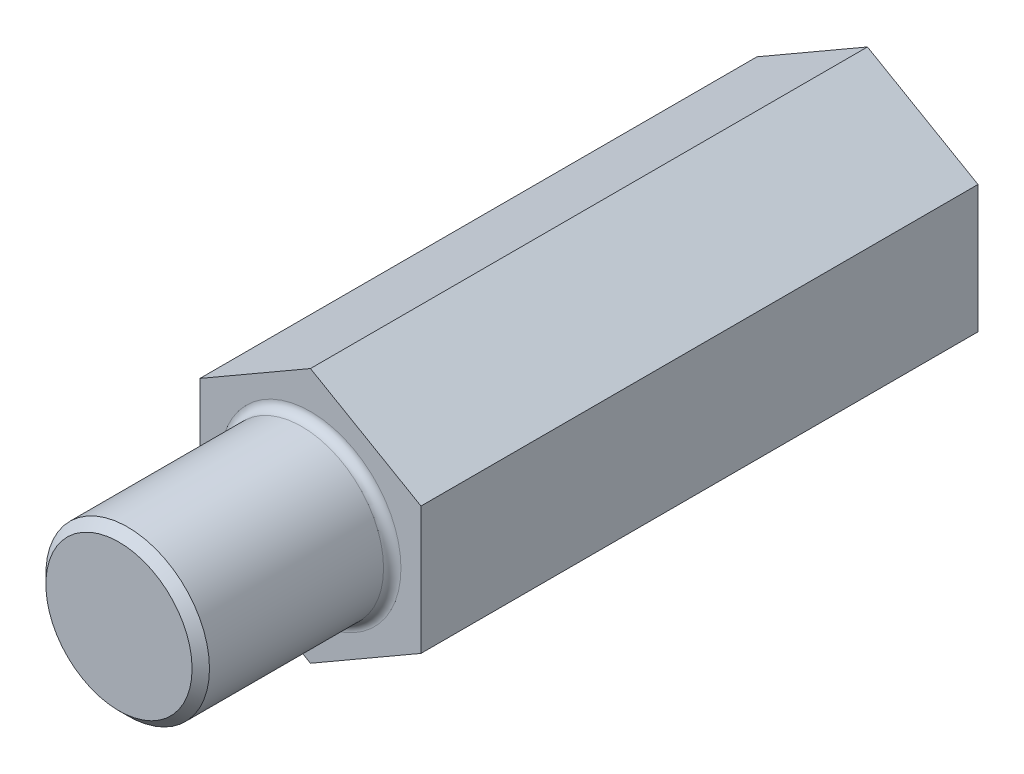
ISO-10303-21;
HEADER;
FILE_DESCRIPTION(('STEP AP214'),'2;1');
FILE_NAME('part.step','',(''),(''),'','','');
FILE_SCHEMA(('AUTOMOTIVE_DESIGN { 1 0 10303 214 1 1 1 1 }'));
ENDSEC;
DATA;
#1=APPLICATION_CONTEXT('core data for automotive mechanical design processes');
#2=APPLICATION_PROTOCOL_DEFINITION('international standard','automotive_design',2000,#1);
#3=PRODUCT_CONTEXT('',#1,'mechanical');
#4=PRODUCT('Part','Part','',(#3));
#5=PRODUCT_RELATED_PRODUCT_CATEGORY('part','',(#4));
#6=PRODUCT_DEFINITION_FORMATION('','',#4);
#7=PRODUCT_DEFINITION_CONTEXT('part definition',#1,'design');
#8=PRODUCT_DEFINITION('design','',#6,#7);
#9=PRODUCT_DEFINITION_SHAPE('','',#8);
#10=(LENGTH_UNIT() NAMED_UNIT(*) SI_UNIT(.MILLI.,.METRE.));
#11=(NAMED_UNIT(*) PLANE_ANGLE_UNIT() SI_UNIT($,.RADIAN.));
#12=(NAMED_UNIT(*) SI_UNIT($,.STERADIAN.) SOLID_ANGLE_UNIT());
#13=UNCERTAINTY_MEASURE_WITH_UNIT(LENGTH_MEASURE(1.E-05),#10,'distance_accuracy_value','');
#14=(GEOMETRIC_REPRESENTATION_CONTEXT(3) GLOBAL_UNCERTAINTY_ASSIGNED_CONTEXT((#13)) GLOBAL_UNIT_ASSIGNED_CONTEXT((#10,
#11,#12)) REPRESENTATION_CONTEXT('',''));
#15=CARTESIAN_POINT('',(0.,0.,0.));
#16=DIRECTION('',(0.,0.,1.));
#17=DIRECTION('',(1.,0.,0.));
#18=AXIS2_PLACEMENT_3D('',#15,#16,#17);
#19=CARTESIAN_POINT('',(6.34999999999996,3.6661742093542,43.));
#20=DIRECTION('',(-0.499999999999995,-0.866025403784442,0.));
#21=DIRECTION('',(0.866025403784442,-0.499999999999995,0.));
#22=AXIS2_PLACEMENT_3D('',#19,#20,#21);
#23=PLANE('',#22);
#24=DIRECTION('',(-0.866025403784442,0.499999999999995,0.));
#25=VECTOR('',#24,1.);
#26=CARTESIAN_POINT('',(6.34999999999996,3.6661742093542,32.));
#27=LINE('',#26,#25);
#28=CARTESIAN_POINT('',(6.34999999999996,3.6661742093542,32.));
#29=VERTEX_POINT('',#28);
#30=CARTESIAN_POINT('',(0.,7.33234841870825,32.));
#31=VERTEX_POINT('',#30);
#32=EDGE_CURVE('E111',#29,#31,#27,.T.);
#33=ORIENTED_EDGE('',*,*,#32,.F.);
#34=DIRECTION('',(0.,0.,-1.));
#35=VECTOR('',#34,1.);
#36=CARTESIAN_POINT('',(6.34999999999996,3.6661742093542,43.));
#37=LINE('',#36,#35);
#38=CARTESIAN_POINT('',(6.34999999999996,3.6661742093542,0.));
#39=VERTEX_POINT('',#38);
#40=EDGE_CURVE('E59',#29,#39,#37,.T.);
#41=ORIENTED_EDGE('',*,*,#40,.T.);
#42=DIRECTION('',(-0.866025403784442,0.499999999999995,0.));
#43=VECTOR('',#42,1.);
#44=CARTESIAN_POINT('',(6.34999999999996,3.6661742093542,0.));
#45=LINE('',#44,#43);
#46=CARTESIAN_POINT('',(0.,7.33234841870825,0.));
#47=VERTEX_POINT('',#46);
#48=EDGE_CURVE('E113',#39,#47,#45,.T.);
#49=ORIENTED_EDGE('',*,*,#48,.T.);
#50=DIRECTION('',(0.,0.,-1.));
#51=VECTOR('',#50,1.);
#52=CARTESIAN_POINT('',(0.,7.33234841870825,43.));
#53=LINE('',#52,#51);
#54=EDGE_CURVE('E138',#31,#47,#53,.T.);
#55=ORIENTED_EDGE('',*,*,#54,.F.);
#56=EDGE_LOOP('',(#33,#41,#49,#55));
#57=FACE_BOUND('',#56,.T.);
#58=ADVANCED_FACE('F35',(#57),#23,.F.);
#59=CARTESIAN_POINT('',(0.,7.33234841870825,43.));
#60=DIRECTION('',(0.500000000000001,-0.866025403784438,0.));
#61=DIRECTION('',(0.866025403784438,0.500000000000001,0.));
#62=AXIS2_PLACEMENT_3D('',#59,#60,#61);
#63=PLANE('',#62);
#64=DIRECTION('',(-0.866025403784438,-0.500000000000001,0.));
#65=VECTOR('',#64,1.);
#66=CARTESIAN_POINT('',(0.,7.33234841870825,32.));
#67=LINE('',#66,#65);
#68=CARTESIAN_POINT('',(-6.35000000000001,3.66617420935411,32.));
#69=VERTEX_POINT('',#68);
#70=EDGE_CURVE('E109',#31,#69,#67,.T.);
#71=ORIENTED_EDGE('',*,*,#70,.F.);
#72=ORIENTED_EDGE('',*,*,#54,.T.);
#73=DIRECTION('',(-0.866025403784438,-0.500000000000001,0.));
#74=VECTOR('',#73,1.);
#75=CARTESIAN_POINT('',(0.,7.33234841870825,0.));
#76=LINE('',#75,#74);
#77=CARTESIAN_POINT('',(-6.35000000000001,3.66617420935411,0.));
#78=VERTEX_POINT('',#77);
#79=EDGE_CURVE('E115',#47,#78,#76,.T.);
#80=ORIENTED_EDGE('',*,*,#79,.T.);
#81=DIRECTION('',(0.,0.,-1.));
#82=VECTOR('',#81,1.);
#83=CARTESIAN_POINT('',(-6.35000000000001,3.66617420935411,43.));
#84=LINE('',#83,#82);
#85=EDGE_CURVE('E136',#69,#78,#84,.T.);
#86=ORIENTED_EDGE('',*,*,#85,.F.);
#87=EDGE_LOOP('',(#71,#72,#80,#86));
#88=FACE_BOUND('',#87,.T.);
#89=ADVANCED_FACE('F166',(#88),#63,.F.);
#90=CARTESIAN_POINT('',(-6.35000000000001,3.66617420935411,43.));
#91=DIRECTION('',(1.,0.,0.));
#92=DIRECTION('',(0.,1.,0.));
#93=AXIS2_PLACEMENT_3D('',#90,#91,#92);
#94=PLANE('',#93);
#95=DIRECTION('',(0.,-1.,0.));
#96=VECTOR('',#95,1.);
#97=CARTESIAN_POINT('',(-6.35000000000001,3.66617420935411,32.));
#98=LINE('',#97,#96);
#99=CARTESIAN_POINT('',(-6.34999999999999,-3.66617420935416,32.));
#100=VERTEX_POINT('',#99);
#101=EDGE_CURVE('E107',#69,#100,#98,.T.);
#102=ORIENTED_EDGE('',*,*,#101,.F.);
#103=ORIENTED_EDGE('',*,*,#85,.T.);
#104=DIRECTION('',(0.,-1.,0.));
#105=VECTOR('',#104,1.);
#106=CARTESIAN_POINT('',(-6.35000000000001,3.66617420935411,0.));
#107=LINE('',#106,#105);
#108=CARTESIAN_POINT('',(-6.34999999999999,-3.66617420935416,0.));
#109=VERTEX_POINT('',#108);
#110=EDGE_CURVE('E118',#78,#109,#107,.T.);
#111=ORIENTED_EDGE('',*,*,#110,.T.);
#112=DIRECTION('',(0.,0.,-1.));
#113=VECTOR('',#112,1.);
#114=CARTESIAN_POINT('',(-6.34999999999999,-3.66617420935416,43.));
#115=LINE('',#114,#113);
#116=EDGE_CURVE('E134',#100,#109,#115,.T.);
#117=ORIENTED_EDGE('',*,*,#116,.F.);
#118=EDGE_LOOP('',(#102,#103,#111,#117));
#119=FACE_BOUND('',#118,.T.);
#120=ADVANCED_FACE('F171',(#119),#94,.F.);
#121=CARTESIAN_POINT('',(-6.34999999999999,-3.66617420935416,43.));
#122=DIRECTION('',(0.499999999999995,0.866025403784442,0.));
#123=DIRECTION('',(-0.866025403784442,0.499999999999995,0.));
#124=AXIS2_PLACEMENT_3D('',#121,#122,#123);
#125=PLANE('',#124);
#126=DIRECTION('',(0.866025403784442,-0.499999999999995,0.));
#127=VECTOR('',#126,1.);
#128=CARTESIAN_POINT('',(-6.34999999999999,-3.66617420935416,32.));
#129=LINE('',#128,#127);
#130=CARTESIAN_POINT('',(0.,-7.33234841870825,32.));
#131=VERTEX_POINT('',#130);
#132=EDGE_CURVE('E103',#100,#131,#129,.T.);
#133=ORIENTED_EDGE('',*,*,#132,.F.);
#134=ORIENTED_EDGE('',*,*,#116,.T.);
#135=DIRECTION('',(0.866025403784442,-0.499999999999995,0.));
#136=VECTOR('',#135,1.);
#137=CARTESIAN_POINT('',(-6.34999999999999,-3.66617420935416,0.));
#138=LINE('',#137,#136);
#139=CARTESIAN_POINT('',(0.,-7.33234841870825,0.));
#140=VERTEX_POINT('',#139);
#141=EDGE_CURVE('E121',#109,#140,#138,.T.);
#142=ORIENTED_EDGE('',*,*,#141,.T.);
#143=DIRECTION('',(0.,0.,-1.));
#144=VECTOR('',#143,1.);
#145=CARTESIAN_POINT('',(0.,-7.33234841870825,43.));
#146=LINE('',#145,#144);
#147=EDGE_CURVE('E132',#131,#140,#146,.T.);
#148=ORIENTED_EDGE('',*,*,#147,.F.);
#149=EDGE_LOOP('',(#133,#134,#142,#148));
#150=FACE_BOUND('',#149,.T.);
#151=ADVANCED_FACE('F217',(#150),#125,.F.);
#152=CARTESIAN_POINT('',(0.,-7.33234841870825,43.));
#153=DIRECTION('',(-0.500000000000007,0.866025403784435,0.));
#154=DIRECTION('',(-0.866025403784435,-0.500000000000007,0.));
#155=AXIS2_PLACEMENT_3D('',#152,#153,#154);
#156=PLANE('',#155);
#157=DIRECTION('',(0.866025403784435,0.500000000000007,0.));
#158=VECTOR('',#157,1.);
#159=CARTESIAN_POINT('',(0.,-7.33234841870825,32.));
#160=LINE('',#159,#158);
#161=CARTESIAN_POINT('',(6.35000000000004,-3.66617420935407,32.));
#162=VERTEX_POINT('',#161);
#163=EDGE_CURVE('E51',#131,#162,#160,.T.);
#164=ORIENTED_EDGE('',*,*,#163,.F.);
#165=ORIENTED_EDGE('',*,*,#147,.T.);
#166=DIRECTION('',(0.866025403784435,0.500000000000007,0.));
#167=VECTOR('',#166,1.);
#168=CARTESIAN_POINT('',(0.,-7.33234841870825,0.));
#169=LINE('',#168,#167);
#170=CARTESIAN_POINT('',(6.35000000000004,-3.66617420935407,0.));
#171=VERTEX_POINT('',#170);
#172=EDGE_CURVE('E124',#140,#171,#169,.T.);
#173=ORIENTED_EDGE('',*,*,#172,.T.);
#174=DIRECTION('',(0.,0.,-1.));
#175=VECTOR('',#174,1.);
#176=CARTESIAN_POINT('',(6.35000000000004,-3.66617420935407,43.));
#177=LINE('',#176,#175);
#178=EDGE_CURVE('E130',#162,#171,#177,.T.);
#179=ORIENTED_EDGE('',*,*,#178,.F.);
#180=EDGE_LOOP('',(#164,#165,#173,#179));
#181=FACE_BOUND('',#180,.T.);
#182=ADVANCED_FACE('F213',(#181),#156,.F.);
#183=CARTESIAN_POINT('',(6.35000000000004,-3.66617420935407,43.));
#184=DIRECTION('',(-1.,0.,0.));
#185=DIRECTION('',(0.,-1.,0.));
#186=AXIS2_PLACEMENT_3D('',#183,#184,#185);
#187=PLANE('',#186);
#188=DIRECTION('',(0.,1.,0.));
#189=VECTOR('',#188,1.);
#190=CARTESIAN_POINT('',(6.35000000000004,-3.66617420935407,32.));
#191=LINE('',#190,#189);
#192=EDGE_CURVE('E140',#162,#29,#191,.T.);
#193=ORIENTED_EDGE('',*,*,#192,.F.);
#194=ORIENTED_EDGE('',*,*,#178,.T.);
#195=DIRECTION('',(0.,1.,0.));
#196=VECTOR('',#195,1.);
#197=CARTESIAN_POINT('',(6.35000000000004,-3.66617420935407,0.));
#198=LINE('',#197,#196);
#199=EDGE_CURVE('E127',#171,#39,#198,.T.);
#200=ORIENTED_EDGE('',*,*,#199,.T.);
#201=ORIENTED_EDGE('',*,*,#40,.F.);
#202=EDGE_LOOP('',(#193,#194,#200,#201));
#203=FACE_BOUND('',#202,.T.);
#204=ADVANCED_FACE('F209',(#203),#187,.F.);
#205=CARTESIAN_POINT('',(0.,0.,0.));
#206=DIRECTION('',(0.,0.,1.));
#207=DIRECTION('',(1.,0.,0.));
#208=AXIS2_PLACEMENT_3D('',#205,#206,#207);
#209=PLANE('',#208);
#210=CARTESIAN_POINT('',(0.,0.,0.));
#211=DIRECTION('',(0.,0.,1.));
#212=DIRECTION('',(1.,0.,0.));
#213=AXIS2_PLACEMENT_3D('',#210,#211,#212);
#214=CIRCLE('',#213,3.675);
#215=CARTESIAN_POINT('',(3.675,0.,0.));
#216=VERTEX_POINT('',#215);
#217=EDGE_CURVE('E11',#216,#216,#214,.T.);
#218=ORIENTED_EDGE('',*,*,#217,.T.);
#219=EDGE_LOOP('',(#218));
#220=FACE_BOUND('',#219,.T.);
#221=ORIENTED_EDGE('',*,*,#48,.F.);
#222=ORIENTED_EDGE('',*,*,#199,.F.);
#223=ORIENTED_EDGE('',*,*,#172,.F.);
#224=ORIENTED_EDGE('',*,*,#141,.F.);
#225=ORIENTED_EDGE('',*,*,#110,.F.);
#226=ORIENTED_EDGE('',*,*,#79,.F.);
#227=EDGE_LOOP('',(#221,#222,#223,#224,#225,#226));
#228=FACE_BOUND('',#227,.T.);
#229=ADVANCED_FACE('F206',(#220,#228),#209,.F.);
#230=CARTESIAN_POINT('',(0.,0.,32.));
#231=DIRECTION('',(0.,0.,1.));
#232=DIRECTION('',(1.,0.,0.));
#233=AXIS2_PLACEMENT_3D('',#230,#231,#232);
#234=PLANE('',#233);
#235=CARTESIAN_POINT('',(0.,0.,32.));
#236=DIRECTION('',(0.,0.,1.));
#237=DIRECTION('',(1.,0.,0.));
#238=AXIS2_PLACEMENT_3D('',#235,#236,#237);
#239=CIRCLE('',#238,5.2);
#240=CARTESIAN_POINT('',(5.2,0.,32.));
#241=VERTEX_POINT('',#240);
#242=EDGE_CURVE('E151',#241,#241,#239,.F.);
#243=ORIENTED_EDGE('',*,*,#242,.T.);
#244=EDGE_LOOP('',(#243));
#245=FACE_BOUND('',#244,.T.);
#246=ORIENTED_EDGE('',*,*,#32,.T.);
#247=ORIENTED_EDGE('',*,*,#70,.T.);
#248=ORIENTED_EDGE('',*,*,#101,.T.);
#249=ORIENTED_EDGE('',*,*,#132,.T.);
#250=ORIENTED_EDGE('',*,*,#163,.T.);
#251=ORIENTED_EDGE('',*,*,#192,.T.);
#252=EDGE_LOOP('',(#246,#247,#248,#249,#250,#251));
#253=FACE_BOUND('',#252,.T.);
#254=ADVANCED_FACE('F194',(#245,#253),#234,.T.);
#255=CARTESIAN_POINT('',(0.,0.,32.));
#256=DIRECTION('',(0.,0.,1.));
#257=DIRECTION('',(1.,0.,0.));
#258=AXIS2_PLACEMENT_3D('',#255,#256,#257);
#259=CYLINDRICAL_SURFACE('',#258,4.7);
#260=CARTESIAN_POINT('',(0.,0.,32.5));
#261=DIRECTION('',(0.,0.,1.));
#262=DIRECTION('',(1.,0.,0.));
#263=AXIS2_PLACEMENT_3D('',#260,#261,#262);
#264=CIRCLE('',#263,4.7);
#265=CARTESIAN_POINT('',(4.7,0.,32.5));
#266=VERTEX_POINT('',#265);
#267=EDGE_CURVE('E148',#266,#266,#264,.T.);
#268=ORIENTED_EDGE('',*,*,#267,.T.);
#269=EDGE_LOOP('',(#268));
#270=FACE_BOUND('',#269,.T.);
#271=CARTESIAN_POINT('',(0.,0.,42.5));
#272=DIRECTION('',(0.,0.,1.));
#273=DIRECTION('',(1.,0.,0.));
#274=AXIS2_PLACEMENT_3D('',#271,#272,#273);
#275=CIRCLE('',#274,4.7);
#276=CARTESIAN_POINT('',(4.7,0.,42.5));
#277=VERTEX_POINT('',#276);
#278=EDGE_CURVE('E145',#277,#277,#275,.F.);
#279=ORIENTED_EDGE('',*,*,#278,.T.);
#280=EDGE_LOOP('',(#279));
#281=FACE_BOUND('',#280,.T.);
#282=ADVANCED_FACE('F191',(#270,#281),#259,.T.);
#283=CARTESIAN_POINT('',(0.,0.,43.));
#284=DIRECTION('',(0.,0.,1.));
#285=DIRECTION('',(1.,0.,0.));
#286=AXIS2_PLACEMENT_3D('',#283,#284,#285);
#287=PLANE('',#286);
#288=CARTESIAN_POINT('',(0.,0.,43.));
#289=DIRECTION('',(0.,0.,1.));
#290=DIRECTION('',(1.,0.,0.));
#291=AXIS2_PLACEMENT_3D('',#288,#289,#290);
#292=CIRCLE('',#291,4.2);
#293=CARTESIAN_POINT('',(4.2,0.,43.));
#294=VERTEX_POINT('',#293);
#295=EDGE_CURVE('E142',#294,#294,#292,.T.);
#296=ORIENTED_EDGE('',*,*,#295,.T.);
#297=EDGE_LOOP('',(#296));
#298=FACE_BOUND('',#297,.T.);
#299=ADVANCED_FACE('F181',(#298),#287,.T.);
#300=CARTESIAN_POINT('',(0.,0.,43.));
#301=DIRECTION('',(0.,0.,-1.));
#302=DIRECTION('',(-1.,0.,0.));
#303=AXIS2_PLACEMENT_3D('',#300,#301,#302);
#304=CONICAL_SURFACE('',#303,4.2,0.785398163397446);
#305=ORIENTED_EDGE('',*,*,#278,.F.);
#306=EDGE_LOOP('',(#305));
#307=FACE_BOUND('',#306,.T.);
#308=ORIENTED_EDGE('',*,*,#295,.F.);
#309=EDGE_LOOP('',(#308));
#310=FACE_BOUND('',#309,.T.);
#311=ADVANCED_FACE('F177',(#307,#310),#304,.T.);
#312=CARTESIAN_POINT('',(0.,0.,32.5));
#313=DIRECTION('',(0.,0.,1.));
#314=DIRECTION('',(1.,0.,0.));
#315=AXIS2_PLACEMENT_3D('',#312,#313,#314);
#316=TOROIDAL_SURFACE('',#315,5.2,0.5);
#317=ORIENTED_EDGE('',*,*,#242,.F.);
#318=EDGE_LOOP('',(#317));
#319=FACE_BOUND('',#318,.T.);
#320=ORIENTED_EDGE('',*,*,#267,.F.);
#321=EDGE_LOOP('',(#320));
#322=FACE_BOUND('',#321,.T.);
#323=ADVANCED_FACE('F96',(#319,#322),#316,.F.);
#324=CARTESIAN_POINT('',(0.,0.,13.));
#325=DIRECTION('',(0.,0.,-1.));
#326=DIRECTION('',(-1.,0.,0.));
#327=AXIS2_PLACEMENT_3D('',#324,#325,#326);
#328=CONICAL_SURFACE('',#327,3.175,1.02974425867665);
#329=CARTESIAN_POINT('',(0.,0.,14.9077324654125));
#330=VERTEX_POINT('',#329);
#331=VERTEX_LOOP('',#330);
#332=FACE_BOUND('',#331,.T.);
#333=CARTESIAN_POINT('',(0.,0.,13.));
#334=DIRECTION('',(0.,0.,-1.));
#335=DIRECTION('',(-1.,0.,0.));
#336=AXIS2_PLACEMENT_3D('',#333,#334,#335);
#337=CIRCLE('',#336,3.175);
#338=CARTESIAN_POINT('',(-3.175,0.,13.));
#339=VERTEX_POINT('',#338);
#340=EDGE_CURVE('E100',#339,#339,#337,.T.);
#341=ORIENTED_EDGE('',*,*,#340,.T.);
#342=EDGE_LOOP('',(#341));
#343=FACE_BOUND('',#342,.T.);
#344=ADVANCED_FACE('F92',(#332,#343),#328,.F.);
#345=CARTESIAN_POINT('',(0.,0.,0.));
#346=DIRECTION('',(0.,0.,-1.));
#347=DIRECTION('',(-1.,0.,0.));
#348=AXIS2_PLACEMENT_3D('',#345,#346,#347);
#349=CYLINDRICAL_SURFACE('',#348,3.175);
#350=CARTESIAN_POINT('',(0.,0.,0.5));
#351=DIRECTION('',(0.,0.,1.));
#352=DIRECTION('',(1.,0.,0.));
#353=AXIS2_PLACEMENT_3D('',#350,#351,#352);
#354=CIRCLE('',#353,3.175);
#355=CARTESIAN_POINT('',(3.175,0.,0.5));
#356=VERTEX_POINT('',#355);
#357=EDGE_CURVE('E44',#356,#356,#354,.F.);
#358=ORIENTED_EDGE('',*,*,#357,.T.);
#359=EDGE_LOOP('',(#358));
#360=FACE_BOUND('',#359,.T.);
#361=ORIENTED_EDGE('',*,*,#340,.F.);
#362=EDGE_LOOP('',(#361));
#363=FACE_BOUND('',#362,.T.);
#364=ADVANCED_FACE('F95',(#360,#363),#349,.F.);
#365=CARTESIAN_POINT('',(0.,0.,0.5));
#366=DIRECTION('',(0.,0.,-1.));
#367=DIRECTION('',(-1.,0.,0.));
#368=AXIS2_PLACEMENT_3D('',#365,#366,#367);
#369=CONICAL_SURFACE('',#368,3.175,0.785398163397448);
#370=ORIENTED_EDGE('',*,*,#217,.F.);
#371=EDGE_LOOP('',(#370));
#372=FACE_BOUND('',#371,.T.);
#373=ORIENTED_EDGE('',*,*,#357,.F.);
#374=EDGE_LOOP('',(#373));
#375=FACE_BOUND('',#374,.T.);
#376=ADVANCED_FACE('F38',(#372,#375),#369,.F.);
#377=CLOSED_SHELL('',(#58,#89,#120,#151,#182,#204,#229,#254,#282,#299,#311,#323,#344,#364,#376));
#378=MANIFOLD_SOLID_BREP('B2',#377);
#379=ADVANCED_BREP_SHAPE_REPRESENTATION('',(#18,#378),#14);
#380=SHAPE_DEFINITION_REPRESENTATION(#9,#379);
ENDSEC;
END-ISO-10303-21;
